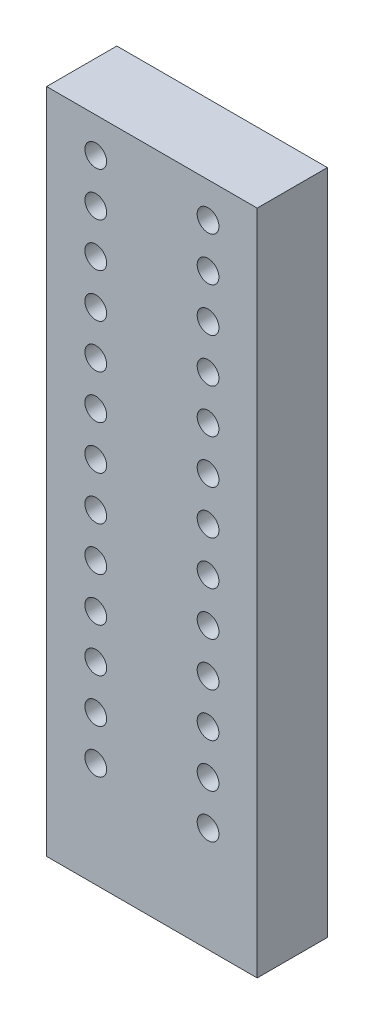
ISO-10303-21;
HEADER;
FILE_DESCRIPTION(('STEP AP214'),'2;1');
FILE_NAME('part.step','',(''),(''),'','','');
FILE_SCHEMA(('AUTOMOTIVE_DESIGN { 1 0 10303 214 1 1 1 1 }'));
ENDSEC;
DATA;
#1=APPLICATION_CONTEXT('core data for automotive mechanical design processes');
#2=APPLICATION_PROTOCOL_DEFINITION('international standard','automotive_design',2000,#1);
#3=PRODUCT_CONTEXT('',#1,'mechanical');
#4=PRODUCT('Part','Part','',(#3));
#5=PRODUCT_RELATED_PRODUCT_CATEGORY('part','',(#4));
#6=PRODUCT_DEFINITION_FORMATION('','',#4);
#7=PRODUCT_DEFINITION_CONTEXT('part definition',#1,'design');
#8=PRODUCT_DEFINITION('design','',#6,#7);
#9=PRODUCT_DEFINITION_SHAPE('','',#8);
#10=(LENGTH_UNIT() NAMED_UNIT(*) SI_UNIT(.MILLI.,.METRE.));
#11=(NAMED_UNIT(*) PLANE_ANGLE_UNIT() SI_UNIT($,.RADIAN.));
#12=(NAMED_UNIT(*) SI_UNIT($,.STERADIAN.) SOLID_ANGLE_UNIT());
#13=UNCERTAINTY_MEASURE_WITH_UNIT(LENGTH_MEASURE(1.E-05),#10,'distance_accuracy_value','');
#14=(GEOMETRIC_REPRESENTATION_CONTEXT(3) GLOBAL_UNCERTAINTY_ASSIGNED_CONTEXT((#13)) GLOBAL_UNIT_ASSIGNED_CONTEXT((#10,
#11,#12)) REPRESENTATION_CONTEXT('',''));
#15=CARTESIAN_POINT('',(0.,0.,0.));
#16=DIRECTION('',(0.,0.,1.));
#17=DIRECTION('',(1.,0.,0.));
#18=AXIS2_PLACEMENT_3D('',#15,#16,#17);
#19=CARTESIAN_POINT('',(16.,85.,20.));
#20=DIRECTION('',(0.,0.,1.));
#21=DIRECTION('',(1.,0.,0.));
#22=AXIS2_PLACEMENT_3D('',#19,#20,#21);
#23=CYLINDRICAL_SURFACE('',#22,3.09999999999999);
#24=CARTESIAN_POINT('',(16.,85.,0.));
#25=DIRECTION('',(0.,0.,1.));
#26=DIRECTION('',(1.,0.,0.));
#27=AXIS2_PLACEMENT_3D('',#24,#25,#26);
#28=CIRCLE('',#27,3.1);
#29=CARTESIAN_POINT('',(19.1,85.,0.));
#30=VERTEX_POINT('',#29);
#31=EDGE_CURVE('E43',#30,#30,#28,.T.);
#32=ORIENTED_EDGE('',*,*,#31,.F.);
#33=EDGE_LOOP('',(#32));
#34=FACE_BOUND('',#33,.T.);
#35=CARTESIAN_POINT('',(16.,85.,20.));
#36=DIRECTION('',(0.,0.,1.));
#37=DIRECTION('',(1.,0.,0.));
#38=AXIS2_PLACEMENT_3D('',#35,#36,#37);
#39=CIRCLE('',#38,3.09999999999999);
#40=CARTESIAN_POINT('',(19.1,85.,20.));
#41=VERTEX_POINT('',#40);
#42=EDGE_CURVE('E11',#41,#41,#39,.T.);
#43=ORIENTED_EDGE('',*,*,#42,.T.);
#44=EDGE_LOOP('',(#43));
#45=FACE_BOUND('',#44,.T.);
#46=ADVANCED_FACE('F35',(#34,#45),#23,.F.);
#47=CARTESIAN_POINT('',(16.,72.5,20.));
#48=DIRECTION('',(0.,0.,1.));
#49=DIRECTION('',(1.,0.,0.));
#50=AXIS2_PLACEMENT_3D('',#47,#48,#49);
#51=CYLINDRICAL_SURFACE('',#50,3.09999999999999);
#52=CARTESIAN_POINT('',(16.,72.5,0.));
#53=DIRECTION('',(0.,0.,1.));
#54=DIRECTION('',(1.,0.,0.));
#55=AXIS2_PLACEMENT_3D('',#52,#53,#54);
#56=CIRCLE('',#55,3.1);
#57=CARTESIAN_POINT('',(19.1,72.5,0.));
#58=VERTEX_POINT('',#57);
#59=EDGE_CURVE('E254',#58,#58,#56,.T.);
#60=ORIENTED_EDGE('',*,*,#59,.F.);
#61=EDGE_LOOP('',(#60));
#62=FACE_BOUND('',#61,.T.);
#63=CARTESIAN_POINT('',(16.,72.5,20.));
#64=DIRECTION('',(0.,0.,1.));
#65=DIRECTION('',(1.,0.,0.));
#66=AXIS2_PLACEMENT_3D('',#63,#64,#65);
#67=CIRCLE('',#66,3.09999999999999);
#68=CARTESIAN_POINT('',(19.1,72.5,20.));
#69=VERTEX_POINT('',#68);
#70=EDGE_CURVE('E257',#69,#69,#67,.T.);
#71=ORIENTED_EDGE('',*,*,#70,.T.);
#72=EDGE_LOOP('',(#71));
#73=FACE_BOUND('',#72,.T.);
#74=ADVANCED_FACE('F266',(#62,#73),#51,.F.);
#75=CARTESIAN_POINT('',(16.,60.,20.));
#76=DIRECTION('',(0.,0.,1.));
#77=DIRECTION('',(1.,0.,0.));
#78=AXIS2_PLACEMENT_3D('',#75,#76,#77);
#79=CYLINDRICAL_SURFACE('',#78,3.09999999999999);
#80=CARTESIAN_POINT('',(16.,60.,0.));
#81=DIRECTION('',(0.,0.,1.));
#82=DIRECTION('',(1.,0.,0.));
#83=AXIS2_PLACEMENT_3D('',#80,#81,#82);
#84=CIRCLE('',#83,3.1);
#85=CARTESIAN_POINT('',(19.1,60.,0.));
#86=VERTEX_POINT('',#85);
#87=EDGE_CURVE('E248',#86,#86,#84,.T.);
#88=ORIENTED_EDGE('',*,*,#87,.F.);
#89=EDGE_LOOP('',(#88));
#90=FACE_BOUND('',#89,.T.);
#91=CARTESIAN_POINT('',(16.,60.,20.));
#92=DIRECTION('',(0.,0.,1.));
#93=DIRECTION('',(1.,0.,0.));
#94=AXIS2_PLACEMENT_3D('',#91,#92,#93);
#95=CIRCLE('',#94,3.09999999999999);
#96=CARTESIAN_POINT('',(19.1,60.,20.));
#97=VERTEX_POINT('',#96);
#98=EDGE_CURVE('E251',#97,#97,#95,.T.);
#99=ORIENTED_EDGE('',*,*,#98,.T.);
#100=EDGE_LOOP('',(#99));
#101=FACE_BOUND('',#100,.T.);
#102=ADVANCED_FACE('F373',(#90,#101),#79,.F.);
#103=CARTESIAN_POINT('',(16.,47.5,20.));
#104=DIRECTION('',(0.,0.,1.));
#105=DIRECTION('',(1.,0.,0.));
#106=AXIS2_PLACEMENT_3D('',#103,#104,#105);
#107=CYLINDRICAL_SURFACE('',#106,3.09999999999999);
#108=CARTESIAN_POINT('',(16.,47.5,0.));
#109=DIRECTION('',(0.,0.,1.));
#110=DIRECTION('',(1.,0.,0.));
#111=AXIS2_PLACEMENT_3D('',#108,#109,#110);
#112=CIRCLE('',#111,3.1);
#113=CARTESIAN_POINT('',(19.1,47.5,0.));
#114=VERTEX_POINT('',#113);
#115=EDGE_CURVE('E242',#114,#114,#112,.T.);
#116=ORIENTED_EDGE('',*,*,#115,.F.);
#117=EDGE_LOOP('',(#116));
#118=FACE_BOUND('',#117,.T.);
#119=CARTESIAN_POINT('',(16.,47.5,20.));
#120=DIRECTION('',(0.,0.,1.));
#121=DIRECTION('',(1.,0.,0.));
#122=AXIS2_PLACEMENT_3D('',#119,#120,#121);
#123=CIRCLE('',#122,3.09999999999999);
#124=CARTESIAN_POINT('',(19.1,47.5,20.));
#125=VERTEX_POINT('',#124);
#126=EDGE_CURVE('E245',#125,#125,#123,.T.);
#127=ORIENTED_EDGE('',*,*,#126,.T.);
#128=EDGE_LOOP('',(#127));
#129=FACE_BOUND('',#128,.T.);
#130=ADVANCED_FACE('F369',(#118,#129),#107,.F.);
#131=CARTESIAN_POINT('',(16.,35.,20.));
#132=DIRECTION('',(0.,0.,1.));
#133=DIRECTION('',(1.,0.,0.));
#134=AXIS2_PLACEMENT_3D('',#131,#132,#133);
#135=CYLINDRICAL_SURFACE('',#134,3.09999999999999);
#136=CARTESIAN_POINT('',(16.,35.,0.));
#137=DIRECTION('',(0.,0.,1.));
#138=DIRECTION('',(1.,0.,0.));
#139=AXIS2_PLACEMENT_3D('',#136,#137,#138);
#140=CIRCLE('',#139,3.1);
#141=CARTESIAN_POINT('',(19.1,35.,0.));
#142=VERTEX_POINT('',#141);
#143=EDGE_CURVE('E236',#142,#142,#140,.T.);
#144=ORIENTED_EDGE('',*,*,#143,.F.);
#145=EDGE_LOOP('',(#144));
#146=FACE_BOUND('',#145,.T.);
#147=CARTESIAN_POINT('',(16.,35.,20.));
#148=DIRECTION('',(0.,0.,1.));
#149=DIRECTION('',(1.,0.,0.));
#150=AXIS2_PLACEMENT_3D('',#147,#148,#149);
#151=CIRCLE('',#150,3.09999999999999);
#152=CARTESIAN_POINT('',(19.1,35.,20.));
#153=VERTEX_POINT('',#152);
#154=EDGE_CURVE('E239',#153,#153,#151,.T.);
#155=ORIENTED_EDGE('',*,*,#154,.T.);
#156=EDGE_LOOP('',(#155));
#157=FACE_BOUND('',#156,.T.);
#158=ADVANCED_FACE('F365',(#146,#157),#135,.F.);
#159=CARTESIAN_POINT('',(16.,22.5,20.));
#160=DIRECTION('',(0.,0.,1.));
#161=DIRECTION('',(1.,0.,0.));
#162=AXIS2_PLACEMENT_3D('',#159,#160,#161);
#163=CYLINDRICAL_SURFACE('',#162,3.09999999999999);
#164=CARTESIAN_POINT('',(16.,22.5,0.));
#165=DIRECTION('',(0.,0.,1.));
#166=DIRECTION('',(1.,0.,0.));
#167=AXIS2_PLACEMENT_3D('',#164,#165,#166);
#168=CIRCLE('',#167,3.1);
#169=CARTESIAN_POINT('',(19.1,22.5,0.));
#170=VERTEX_POINT('',#169);
#171=EDGE_CURVE('E230',#170,#170,#168,.T.);
#172=ORIENTED_EDGE('',*,*,#171,.F.);
#173=EDGE_LOOP('',(#172));
#174=FACE_BOUND('',#173,.T.);
#175=CARTESIAN_POINT('',(16.,22.5,20.));
#176=DIRECTION('',(0.,0.,1.));
#177=DIRECTION('',(1.,0.,0.));
#178=AXIS2_PLACEMENT_3D('',#175,#176,#177);
#179=CIRCLE('',#178,3.09999999999999);
#180=CARTESIAN_POINT('',(19.1,22.5,20.));
#181=VERTEX_POINT('',#180);
#182=EDGE_CURVE('E233',#181,#181,#179,.T.);
#183=ORIENTED_EDGE('',*,*,#182,.T.);
#184=EDGE_LOOP('',(#183));
#185=FACE_BOUND('',#184,.T.);
#186=ADVANCED_FACE('F361',(#174,#185),#163,.F.);
#187=CARTESIAN_POINT('',(16.,10.,20.));
#188=DIRECTION('',(0.,0.,1.));
#189=DIRECTION('',(1.,0.,0.));
#190=AXIS2_PLACEMENT_3D('',#187,#188,#189);
#191=CYLINDRICAL_SURFACE('',#190,3.09999999999999);
#192=CARTESIAN_POINT('',(16.,10.,0.));
#193=DIRECTION('',(0.,0.,1.));
#194=DIRECTION('',(1.,0.,0.));
#195=AXIS2_PLACEMENT_3D('',#192,#193,#194);
#196=CIRCLE('',#195,3.1);
#197=CARTESIAN_POINT('',(19.1,10.,0.));
#198=VERTEX_POINT('',#197);
#199=EDGE_CURVE('E224',#198,#198,#196,.T.);
#200=ORIENTED_EDGE('',*,*,#199,.F.);
#201=EDGE_LOOP('',(#200));
#202=FACE_BOUND('',#201,.T.);
#203=CARTESIAN_POINT('',(16.,10.,20.));
#204=DIRECTION('',(0.,0.,1.));
#205=DIRECTION('',(1.,0.,0.));
#206=AXIS2_PLACEMENT_3D('',#203,#204,#205);
#207=CIRCLE('',#206,3.09999999999999);
#208=CARTESIAN_POINT('',(19.1,10.,20.));
#209=VERTEX_POINT('',#208);
#210=EDGE_CURVE('E227',#209,#209,#207,.T.);
#211=ORIENTED_EDGE('',*,*,#210,.T.);
#212=EDGE_LOOP('',(#211));
#213=FACE_BOUND('',#212,.T.);
#214=ADVANCED_FACE('F357',(#202,#213),#191,.F.);
#215=CARTESIAN_POINT('',(16.,-2.5,20.));
#216=DIRECTION('',(0.,0.,1.));
#217=DIRECTION('',(1.,0.,0.));
#218=AXIS2_PLACEMENT_3D('',#215,#216,#217);
#219=CYLINDRICAL_SURFACE('',#218,3.09999999999999);
#220=CARTESIAN_POINT('',(16.,-2.5,0.));
#221=DIRECTION('',(0.,0.,1.));
#222=DIRECTION('',(1.,0.,0.));
#223=AXIS2_PLACEMENT_3D('',#220,#221,#222);
#224=CIRCLE('',#223,3.1);
#225=CARTESIAN_POINT('',(19.1,-2.5,0.));
#226=VERTEX_POINT('',#225);
#227=EDGE_CURVE('E218',#226,#226,#224,.T.);
#228=ORIENTED_EDGE('',*,*,#227,.F.);
#229=EDGE_LOOP('',(#228));
#230=FACE_BOUND('',#229,.T.);
#231=CARTESIAN_POINT('',(16.,-2.5,20.));
#232=DIRECTION('',(0.,0.,1.));
#233=DIRECTION('',(1.,0.,0.));
#234=AXIS2_PLACEMENT_3D('',#231,#232,#233);
#235=CIRCLE('',#234,3.09999999999999);
#236=CARTESIAN_POINT('',(19.1,-2.5,20.));
#237=VERTEX_POINT('',#236);
#238=EDGE_CURVE('E221',#237,#237,#235,.T.);
#239=ORIENTED_EDGE('',*,*,#238,.T.);
#240=EDGE_LOOP('',(#239));
#241=FACE_BOUND('',#240,.T.);
#242=ADVANCED_FACE('F353',(#230,#241),#219,.F.);
#243=CARTESIAN_POINT('',(16.,-15.,20.));
#244=DIRECTION('',(0.,0.,1.));
#245=DIRECTION('',(1.,0.,0.));
#246=AXIS2_PLACEMENT_3D('',#243,#244,#245);
#247=CYLINDRICAL_SURFACE('',#246,3.09999999999999);
#248=CARTESIAN_POINT('',(16.,-15.,0.));
#249=DIRECTION('',(0.,0.,1.));
#250=DIRECTION('',(1.,0.,0.));
#251=AXIS2_PLACEMENT_3D('',#248,#249,#250);
#252=CIRCLE('',#251,3.1);
#253=CARTESIAN_POINT('',(19.1,-15.,0.));
#254=VERTEX_POINT('',#253);
#255=EDGE_CURVE('E212',#254,#254,#252,.T.);
#256=ORIENTED_EDGE('',*,*,#255,.F.);
#257=EDGE_LOOP('',(#256));
#258=FACE_BOUND('',#257,.T.);
#259=CARTESIAN_POINT('',(16.,-15.,20.));
#260=DIRECTION('',(0.,0.,1.));
#261=DIRECTION('',(1.,0.,0.));
#262=AXIS2_PLACEMENT_3D('',#259,#260,#261);
#263=CIRCLE('',#262,3.09999999999999);
#264=CARTESIAN_POINT('',(19.1,-15.,20.));
#265=VERTEX_POINT('',#264);
#266=EDGE_CURVE('E215',#265,#265,#263,.T.);
#267=ORIENTED_EDGE('',*,*,#266,.T.);
#268=EDGE_LOOP('',(#267));
#269=FACE_BOUND('',#268,.T.);
#270=ADVANCED_FACE('F349',(#258,#269),#247,.F.);
#271=CARTESIAN_POINT('',(16.,-27.5,20.));
#272=DIRECTION('',(0.,0.,1.));
#273=DIRECTION('',(1.,0.,0.));
#274=AXIS2_PLACEMENT_3D('',#271,#272,#273);
#275=CYLINDRICAL_SURFACE('',#274,3.09999999999999);
#276=CARTESIAN_POINT('',(16.,-27.5,0.));
#277=DIRECTION('',(0.,0.,1.));
#278=DIRECTION('',(1.,0.,0.));
#279=AXIS2_PLACEMENT_3D('',#276,#277,#278);
#280=CIRCLE('',#279,3.1);
#281=CARTESIAN_POINT('',(19.1,-27.5,0.));
#282=VERTEX_POINT('',#281);
#283=EDGE_CURVE('E206',#282,#282,#280,.T.);
#284=ORIENTED_EDGE('',*,*,#283,.F.);
#285=EDGE_LOOP('',(#284));
#286=FACE_BOUND('',#285,.T.);
#287=CARTESIAN_POINT('',(16.,-27.5,20.));
#288=DIRECTION('',(0.,0.,1.));
#289=DIRECTION('',(1.,0.,0.));
#290=AXIS2_PLACEMENT_3D('',#287,#288,#289);
#291=CIRCLE('',#290,3.09999999999999);
#292=CARTESIAN_POINT('',(19.1,-27.5,20.));
#293=VERTEX_POINT('',#292);
#294=EDGE_CURVE('E209',#293,#293,#291,.T.);
#295=ORIENTED_EDGE('',*,*,#294,.T.);
#296=EDGE_LOOP('',(#295));
#297=FACE_BOUND('',#296,.T.);
#298=ADVANCED_FACE('F345',(#286,#297),#275,.F.);
#299=CARTESIAN_POINT('',(16.,-40.,20.));
#300=DIRECTION('',(0.,0.,1.));
#301=DIRECTION('',(1.,0.,0.));
#302=AXIS2_PLACEMENT_3D('',#299,#300,#301);
#303=CYLINDRICAL_SURFACE('',#302,3.09999999999999);
#304=CARTESIAN_POINT('',(16.,-40.,0.));
#305=DIRECTION('',(0.,0.,1.));
#306=DIRECTION('',(1.,0.,0.));
#307=AXIS2_PLACEMENT_3D('',#304,#305,#306);
#308=CIRCLE('',#307,3.1);
#309=CARTESIAN_POINT('',(19.1,-40.,0.));
#310=VERTEX_POINT('',#309);
#311=EDGE_CURVE('E200',#310,#310,#308,.T.);
#312=ORIENTED_EDGE('',*,*,#311,.F.);
#313=EDGE_LOOP('',(#312));
#314=FACE_BOUND('',#313,.T.);
#315=CARTESIAN_POINT('',(16.,-40.,20.));
#316=DIRECTION('',(0.,0.,1.));
#317=DIRECTION('',(1.,0.,0.));
#318=AXIS2_PLACEMENT_3D('',#315,#316,#317);
#319=CIRCLE('',#318,3.09999999999999);
#320=CARTESIAN_POINT('',(19.1,-40.,20.));
#321=VERTEX_POINT('',#320);
#322=EDGE_CURVE('E203',#321,#321,#319,.T.);
#323=ORIENTED_EDGE('',*,*,#322,.T.);
#324=EDGE_LOOP('',(#323));
#325=FACE_BOUND('',#324,.T.);
#326=ADVANCED_FACE('F341',(#314,#325),#303,.F.);
#327=CARTESIAN_POINT('',(-16.,85.,20.));
#328=DIRECTION('',(0.,0.,1.));
#329=DIRECTION('',(1.,0.,0.));
#330=AXIS2_PLACEMENT_3D('',#327,#328,#329);
#331=CYLINDRICAL_SURFACE('',#330,3.09999999999999);
#332=CARTESIAN_POINT('',(-16.,85.,0.));
#333=DIRECTION('',(0.,0.,1.));
#334=DIRECTION('',(1.,0.,0.));
#335=AXIS2_PLACEMENT_3D('',#332,#333,#334);
#336=CIRCLE('',#335,3.1);
#337=CARTESIAN_POINT('',(-12.9,85.,0.));
#338=VERTEX_POINT('',#337);
#339=EDGE_CURVE('E194',#338,#338,#336,.T.);
#340=ORIENTED_EDGE('',*,*,#339,.F.);
#341=EDGE_LOOP('',(#340));
#342=FACE_BOUND('',#341,.T.);
#343=CARTESIAN_POINT('',(-16.,85.,20.));
#344=DIRECTION('',(0.,0.,1.));
#345=DIRECTION('',(1.,0.,0.));
#346=AXIS2_PLACEMENT_3D('',#343,#344,#345);
#347=CIRCLE('',#346,3.09999999999999);
#348=CARTESIAN_POINT('',(-12.9,85.,20.));
#349=VERTEX_POINT('',#348);
#350=EDGE_CURVE('E197',#349,#349,#347,.T.);
#351=ORIENTED_EDGE('',*,*,#350,.T.);
#352=EDGE_LOOP('',(#351));
#353=FACE_BOUND('',#352,.T.);
#354=ADVANCED_FACE('F337',(#342,#353),#331,.F.);
#355=CARTESIAN_POINT('',(-16.,72.5,20.));
#356=DIRECTION('',(0.,0.,1.));
#357=DIRECTION('',(1.,0.,0.));
#358=AXIS2_PLACEMENT_3D('',#355,#356,#357);
#359=CYLINDRICAL_SURFACE('',#358,3.09999999999999);
#360=CARTESIAN_POINT('',(-16.,72.5,0.));
#361=DIRECTION('',(0.,0.,1.));
#362=DIRECTION('',(1.,0.,0.));
#363=AXIS2_PLACEMENT_3D('',#360,#361,#362);
#364=CIRCLE('',#363,3.1);
#365=CARTESIAN_POINT('',(-12.9,72.5,0.));
#366=VERTEX_POINT('',#365);
#367=EDGE_CURVE('E188',#366,#366,#364,.T.);
#368=ORIENTED_EDGE('',*,*,#367,.F.);
#369=EDGE_LOOP('',(#368));
#370=FACE_BOUND('',#369,.T.);
#371=CARTESIAN_POINT('',(-16.,72.5,20.));
#372=DIRECTION('',(0.,0.,1.));
#373=DIRECTION('',(1.,0.,0.));
#374=AXIS2_PLACEMENT_3D('',#371,#372,#373);
#375=CIRCLE('',#374,3.09999999999999);
#376=CARTESIAN_POINT('',(-12.9,72.5,20.));
#377=VERTEX_POINT('',#376);
#378=EDGE_CURVE('E191',#377,#377,#375,.T.);
#379=ORIENTED_EDGE('',*,*,#378,.T.);
#380=EDGE_LOOP('',(#379));
#381=FACE_BOUND('',#380,.T.);
#382=ADVANCED_FACE('F333',(#370,#381),#359,.F.);
#383=CARTESIAN_POINT('',(-16.,60.,20.));
#384=DIRECTION('',(0.,0.,1.));
#385=DIRECTION('',(1.,0.,0.));
#386=AXIS2_PLACEMENT_3D('',#383,#384,#385);
#387=CYLINDRICAL_SURFACE('',#386,3.09999999999999);
#388=CARTESIAN_POINT('',(-16.,60.,0.));
#389=DIRECTION('',(0.,0.,1.));
#390=DIRECTION('',(1.,0.,0.));
#391=AXIS2_PLACEMENT_3D('',#388,#389,#390);
#392=CIRCLE('',#391,3.1);
#393=CARTESIAN_POINT('',(-12.9,60.,0.));
#394=VERTEX_POINT('',#393);
#395=EDGE_CURVE('E182',#394,#394,#392,.T.);
#396=ORIENTED_EDGE('',*,*,#395,.F.);
#397=EDGE_LOOP('',(#396));
#398=FACE_BOUND('',#397,.T.);
#399=CARTESIAN_POINT('',(-16.,60.,20.));
#400=DIRECTION('',(0.,0.,1.));
#401=DIRECTION('',(1.,0.,0.));
#402=AXIS2_PLACEMENT_3D('',#399,#400,#401);
#403=CIRCLE('',#402,3.09999999999999);
#404=CARTESIAN_POINT('',(-12.9,60.,20.));
#405=VERTEX_POINT('',#404);
#406=EDGE_CURVE('E185',#405,#405,#403,.T.);
#407=ORIENTED_EDGE('',*,*,#406,.T.);
#408=EDGE_LOOP('',(#407));
#409=FACE_BOUND('',#408,.T.);
#410=ADVANCED_FACE('F329',(#398,#409),#387,.F.);
#411=CARTESIAN_POINT('',(-16.,47.5,20.));
#412=DIRECTION('',(0.,0.,1.));
#413=DIRECTION('',(1.,0.,0.));
#414=AXIS2_PLACEMENT_3D('',#411,#412,#413);
#415=CYLINDRICAL_SURFACE('',#414,3.09999999999999);
#416=CARTESIAN_POINT('',(-16.,47.5,0.));
#417=DIRECTION('',(0.,0.,1.));
#418=DIRECTION('',(1.,0.,0.));
#419=AXIS2_PLACEMENT_3D('',#416,#417,#418);
#420=CIRCLE('',#419,3.1);
#421=CARTESIAN_POINT('',(-12.9,47.5,0.));
#422=VERTEX_POINT('',#421);
#423=EDGE_CURVE('E176',#422,#422,#420,.T.);
#424=ORIENTED_EDGE('',*,*,#423,.F.);
#425=EDGE_LOOP('',(#424));
#426=FACE_BOUND('',#425,.T.);
#427=CARTESIAN_POINT('',(-16.,47.5,20.));
#428=DIRECTION('',(0.,0.,1.));
#429=DIRECTION('',(1.,0.,0.));
#430=AXIS2_PLACEMENT_3D('',#427,#428,#429);
#431=CIRCLE('',#430,3.09999999999999);
#432=CARTESIAN_POINT('',(-12.9,47.5,20.));
#433=VERTEX_POINT('',#432);
#434=EDGE_CURVE('E179',#433,#433,#431,.T.);
#435=ORIENTED_EDGE('',*,*,#434,.T.);
#436=EDGE_LOOP('',(#435));
#437=FACE_BOUND('',#436,.T.);
#438=ADVANCED_FACE('F325',(#426,#437),#415,.F.);
#439=CARTESIAN_POINT('',(-16.,35.,20.));
#440=DIRECTION('',(0.,0.,1.));
#441=DIRECTION('',(1.,0.,0.));
#442=AXIS2_PLACEMENT_3D('',#439,#440,#441);
#443=CYLINDRICAL_SURFACE('',#442,3.09999999999999);
#444=CARTESIAN_POINT('',(-16.,35.,0.));
#445=DIRECTION('',(0.,0.,1.));
#446=DIRECTION('',(1.,0.,0.));
#447=AXIS2_PLACEMENT_3D('',#444,#445,#446);
#448=CIRCLE('',#447,3.1);
#449=CARTESIAN_POINT('',(-12.9,35.,0.));
#450=VERTEX_POINT('',#449);
#451=EDGE_CURVE('E170',#450,#450,#448,.T.);
#452=ORIENTED_EDGE('',*,*,#451,.F.);
#453=EDGE_LOOP('',(#452));
#454=FACE_BOUND('',#453,.T.);
#455=CARTESIAN_POINT('',(-16.,35.,20.));
#456=DIRECTION('',(0.,0.,1.));
#457=DIRECTION('',(1.,0.,0.));
#458=AXIS2_PLACEMENT_3D('',#455,#456,#457);
#459=CIRCLE('',#458,3.09999999999999);
#460=CARTESIAN_POINT('',(-12.9,35.,20.));
#461=VERTEX_POINT('',#460);
#462=EDGE_CURVE('E173',#461,#461,#459,.T.);
#463=ORIENTED_EDGE('',*,*,#462,.T.);
#464=EDGE_LOOP('',(#463));
#465=FACE_BOUND('',#464,.T.);
#466=ADVANCED_FACE('F321',(#454,#465),#443,.F.);
#467=CARTESIAN_POINT('',(-16.,22.5,20.));
#468=DIRECTION('',(0.,0.,1.));
#469=DIRECTION('',(1.,0.,0.));
#470=AXIS2_PLACEMENT_3D('',#467,#468,#469);
#471=CYLINDRICAL_SURFACE('',#470,3.09999999999999);
#472=CARTESIAN_POINT('',(-16.,22.5,0.));
#473=DIRECTION('',(0.,0.,1.));
#474=DIRECTION('',(1.,0.,0.));
#475=AXIS2_PLACEMENT_3D('',#472,#473,#474);
#476=CIRCLE('',#475,3.1);
#477=CARTESIAN_POINT('',(-12.9,22.5,0.));
#478=VERTEX_POINT('',#477);
#479=EDGE_CURVE('E164',#478,#478,#476,.T.);
#480=ORIENTED_EDGE('',*,*,#479,.F.);
#481=EDGE_LOOP('',(#480));
#482=FACE_BOUND('',#481,.T.);
#483=CARTESIAN_POINT('',(-16.,22.5,20.));
#484=DIRECTION('',(0.,0.,1.));
#485=DIRECTION('',(1.,0.,0.));
#486=AXIS2_PLACEMENT_3D('',#483,#484,#485);
#487=CIRCLE('',#486,3.09999999999999);
#488=CARTESIAN_POINT('',(-12.9,22.5,20.));
#489=VERTEX_POINT('',#488);
#490=EDGE_CURVE('E167',#489,#489,#487,.T.);
#491=ORIENTED_EDGE('',*,*,#490,.T.);
#492=EDGE_LOOP('',(#491));
#493=FACE_BOUND('',#492,.T.);
#494=ADVANCED_FACE('F317',(#482,#493),#471,.F.);
#495=CARTESIAN_POINT('',(-16.,10.,20.));
#496=DIRECTION('',(0.,0.,1.));
#497=DIRECTION('',(1.,0.,0.));
#498=AXIS2_PLACEMENT_3D('',#495,#496,#497);
#499=CYLINDRICAL_SURFACE('',#498,3.09999999999999);
#500=CARTESIAN_POINT('',(-16.,10.,0.));
#501=DIRECTION('',(0.,0.,1.));
#502=DIRECTION('',(1.,0.,0.));
#503=AXIS2_PLACEMENT_3D('',#500,#501,#502);
#504=CIRCLE('',#503,3.1);
#505=CARTESIAN_POINT('',(-12.9,10.,0.));
#506=VERTEX_POINT('',#505);
#507=EDGE_CURVE('E158',#506,#506,#504,.T.);
#508=ORIENTED_EDGE('',*,*,#507,.F.);
#509=EDGE_LOOP('',(#508));
#510=FACE_BOUND('',#509,.T.);
#511=CARTESIAN_POINT('',(-16.,10.,20.));
#512=DIRECTION('',(0.,0.,1.));
#513=DIRECTION('',(1.,0.,0.));
#514=AXIS2_PLACEMENT_3D('',#511,#512,#513);
#515=CIRCLE('',#514,3.09999999999999);
#516=CARTESIAN_POINT('',(-12.9,10.,20.));
#517=VERTEX_POINT('',#516);
#518=EDGE_CURVE('E161',#517,#517,#515,.T.);
#519=ORIENTED_EDGE('',*,*,#518,.T.);
#520=EDGE_LOOP('',(#519));
#521=FACE_BOUND('',#520,.T.);
#522=ADVANCED_FACE('F313',(#510,#521),#499,.F.);
#523=CARTESIAN_POINT('',(-16.,-2.5,20.));
#524=DIRECTION('',(0.,0.,1.));
#525=DIRECTION('',(1.,0.,0.));
#526=AXIS2_PLACEMENT_3D('',#523,#524,#525);
#527=CYLINDRICAL_SURFACE('',#526,3.09999999999999);
#528=CARTESIAN_POINT('',(-16.,-2.5,0.));
#529=DIRECTION('',(0.,0.,1.));
#530=DIRECTION('',(1.,0.,0.));
#531=AXIS2_PLACEMENT_3D('',#528,#529,#530);
#532=CIRCLE('',#531,3.1);
#533=CARTESIAN_POINT('',(-12.9,-2.5,0.));
#534=VERTEX_POINT('',#533);
#535=EDGE_CURVE('E152',#534,#534,#532,.T.);
#536=ORIENTED_EDGE('',*,*,#535,.F.);
#537=EDGE_LOOP('',(#536));
#538=FACE_BOUND('',#537,.T.);
#539=CARTESIAN_POINT('',(-16.,-2.5,20.));
#540=DIRECTION('',(0.,0.,1.));
#541=DIRECTION('',(1.,0.,0.));
#542=AXIS2_PLACEMENT_3D('',#539,#540,#541);
#543=CIRCLE('',#542,3.09999999999999);
#544=CARTESIAN_POINT('',(-12.9,-2.5,20.));
#545=VERTEX_POINT('',#544);
#546=EDGE_CURVE('E155',#545,#545,#543,.T.);
#547=ORIENTED_EDGE('',*,*,#546,.T.);
#548=EDGE_LOOP('',(#547));
#549=FACE_BOUND('',#548,.T.);
#550=ADVANCED_FACE('F309',(#538,#549),#527,.F.);
#551=CARTESIAN_POINT('',(-16.,-15.,20.));
#552=DIRECTION('',(0.,0.,1.));
#553=DIRECTION('',(1.,0.,0.));
#554=AXIS2_PLACEMENT_3D('',#551,#552,#553);
#555=CYLINDRICAL_SURFACE('',#554,3.09999999999999);
#556=CARTESIAN_POINT('',(-16.,-15.,0.));
#557=DIRECTION('',(0.,0.,1.));
#558=DIRECTION('',(1.,0.,0.));
#559=AXIS2_PLACEMENT_3D('',#556,#557,#558);
#560=CIRCLE('',#559,3.1);
#561=CARTESIAN_POINT('',(-12.9,-15.,0.));
#562=VERTEX_POINT('',#561);
#563=EDGE_CURVE('E146',#562,#562,#560,.T.);
#564=ORIENTED_EDGE('',*,*,#563,.F.);
#565=EDGE_LOOP('',(#564));
#566=FACE_BOUND('',#565,.T.);
#567=CARTESIAN_POINT('',(-16.,-15.,20.));
#568=DIRECTION('',(0.,0.,1.));
#569=DIRECTION('',(1.,0.,0.));
#570=AXIS2_PLACEMENT_3D('',#567,#568,#569);
#571=CIRCLE('',#570,3.09999999999999);
#572=CARTESIAN_POINT('',(-12.9,-15.,20.));
#573=VERTEX_POINT('',#572);
#574=EDGE_CURVE('E149',#573,#573,#571,.T.);
#575=ORIENTED_EDGE('',*,*,#574,.T.);
#576=EDGE_LOOP('',(#575));
#577=FACE_BOUND('',#576,.T.);
#578=ADVANCED_FACE('F305',(#566,#577),#555,.F.);
#579=CARTESIAN_POINT('',(-16.,-27.5,20.));
#580=DIRECTION('',(0.,0.,1.));
#581=DIRECTION('',(1.,0.,0.));
#582=AXIS2_PLACEMENT_3D('',#579,#580,#581);
#583=CYLINDRICAL_SURFACE('',#582,3.09999999999999);
#584=CARTESIAN_POINT('',(-16.,-27.5,0.));
#585=DIRECTION('',(0.,0.,1.));
#586=DIRECTION('',(1.,0.,0.));
#587=AXIS2_PLACEMENT_3D('',#584,#585,#586);
#588=CIRCLE('',#587,3.1);
#589=CARTESIAN_POINT('',(-12.9,-27.5,0.));
#590=VERTEX_POINT('',#589);
#591=EDGE_CURVE('E140',#590,#590,#588,.T.);
#592=ORIENTED_EDGE('',*,*,#591,.F.);
#593=EDGE_LOOP('',(#592));
#594=FACE_BOUND('',#593,.T.);
#595=CARTESIAN_POINT('',(-16.,-27.5,20.));
#596=DIRECTION('',(0.,0.,1.));
#597=DIRECTION('',(1.,0.,0.));
#598=AXIS2_PLACEMENT_3D('',#595,#596,#597);
#599=CIRCLE('',#598,3.09999999999999);
#600=CARTESIAN_POINT('',(-12.9,-27.5,20.));
#601=VERTEX_POINT('',#600);
#602=EDGE_CURVE('E143',#601,#601,#599,.T.);
#603=ORIENTED_EDGE('',*,*,#602,.T.);
#604=EDGE_LOOP('',(#603));
#605=FACE_BOUND('',#604,.T.);
#606=ADVANCED_FACE('F281',(#594,#605),#583,.F.);
#607=CARTESIAN_POINT('',(-16.,-40.,20.));
#608=DIRECTION('',(0.,0.,1.));
#609=DIRECTION('',(1.,0.,0.));
#610=AXIS2_PLACEMENT_3D('',#607,#608,#609);
#611=CYLINDRICAL_SURFACE('',#610,3.09999999999999);
#612=CARTESIAN_POINT('',(-16.,-40.,0.));
#613=DIRECTION('',(0.,0.,1.));
#614=DIRECTION('',(1.,0.,0.));
#615=AXIS2_PLACEMENT_3D('',#612,#613,#614);
#616=CIRCLE('',#615,3.1);
#617=CARTESIAN_POINT('',(-12.9,-40.,0.));
#618=VERTEX_POINT('',#617);
#619=EDGE_CURVE('E134',#618,#618,#616,.T.);
#620=ORIENTED_EDGE('',*,*,#619,.F.);
#621=EDGE_LOOP('',(#620));
#622=FACE_BOUND('',#621,.T.);
#623=CARTESIAN_POINT('',(-16.,-40.,20.));
#624=DIRECTION('',(0.,0.,1.));
#625=DIRECTION('',(1.,0.,0.));
#626=AXIS2_PLACEMENT_3D('',#623,#624,#625);
#627=CIRCLE('',#626,3.09999999999999);
#628=CARTESIAN_POINT('',(-12.9,-40.,20.));
#629=VERTEX_POINT('',#628);
#630=EDGE_CURVE('E137',#629,#629,#627,.T.);
#631=ORIENTED_EDGE('',*,*,#630,.T.);
#632=EDGE_LOOP('',(#631));
#633=FACE_BOUND('',#632,.T.);
#634=ADVANCED_FACE('F271',(#622,#633),#611,.F.);
#635=CARTESIAN_POINT('',(0.,0.,20.));
#636=DIRECTION('',(0.,0.,-1.));
#637=DIRECTION('',(-1.,0.,0.));
#638=AXIS2_PLACEMENT_3D('',#635,#636,#637);
#639=PLANE('',#638);
#640=CARTESIAN_POINT('',(16.,-52.5,20.));
#641=DIRECTION('',(0.,0.,1.));
#642=DIRECTION('',(1.,0.,0.));
#643=AXIS2_PLACEMENT_3D('',#640,#641,#642);
#644=CIRCLE('',#643,3.09999999999999);
#645=CARTESIAN_POINT('',(19.1,-52.5,20.));
#646=VERTEX_POINT('',#645);
#647=EDGE_CURVE('E650',#646,#646,#644,.T.);
#648=ORIENTED_EDGE('',*,*,#647,.F.);
#649=EDGE_LOOP('',(#648));
#650=FACE_BOUND('',#649,.T.);
#651=CARTESIAN_POINT('',(-16.,-52.5,20.));
#652=DIRECTION('',(0.,0.,1.));
#653=DIRECTION('',(1.,0.,0.));
#654=AXIS2_PLACEMENT_3D('',#651,#652,#653);
#655=CIRCLE('',#654,3.09999999999999);
#656=CARTESIAN_POINT('',(-12.9,-52.5,20.));
#657=VERTEX_POINT('',#656);
#658=EDGE_CURVE('E644',#657,#657,#655,.T.);
#659=ORIENTED_EDGE('',*,*,#658,.F.);
#660=EDGE_LOOP('',(#659));
#661=FACE_BOUND('',#660,.T.);
#662=CARTESIAN_POINT('',(16.,-65.,20.));
#663=DIRECTION('',(0.,0.,1.));
#664=DIRECTION('',(1.,0.,0.));
#665=AXIS2_PLACEMENT_3D('',#662,#663,#664);
#666=CIRCLE('',#665,3.09999999999999);
#667=CARTESIAN_POINT('',(19.1,-65.,20.));
#668=VERTEX_POINT('',#667);
#669=EDGE_CURVE('E634',#668,#668,#666,.T.);
#670=ORIENTED_EDGE('',*,*,#669,.F.);
#671=EDGE_LOOP('',(#670));
#672=FACE_BOUND('',#671,.T.);
#673=DIRECTION('',(0.,1.,0.));
#674=VECTOR('',#673,1.);
#675=CARTESIAN_POINT('',(30.,-95.,20.));
#676=LINE('',#675,#674);
#677=CARTESIAN_POINT('',(30.,-95.,20.));
#678=VERTEX_POINT('',#677);
#679=CARTESIAN_POINT('',(30.,95.,20.));
#680=VERTEX_POINT('',#679);
#681=EDGE_CURVE('E114',#678,#680,#676,.T.);
#682=ORIENTED_EDGE('',*,*,#681,.T.);
#683=DIRECTION('',(-1.,0.,0.));
#684=VECTOR('',#683,1.);
#685=CARTESIAN_POINT('',(-30.,95.,20.));
#686=LINE('',#685,#684);
#687=CARTESIAN_POINT('',(-30.,95.,20.));
#688=VERTEX_POINT('',#687);
#689=EDGE_CURVE('E83',#680,#688,#686,.T.);
#690=ORIENTED_EDGE('',*,*,#689,.T.);
#691=DIRECTION('',(0.,-1.,0.));
#692=VECTOR('',#691,1.);
#693=CARTESIAN_POINT('',(-30.,-95.,20.));
#694=LINE('',#693,#692);
#695=CARTESIAN_POINT('',(-30.,-95.,20.));
#696=VERTEX_POINT('',#695);
#697=EDGE_CURVE('E117',#688,#696,#694,.T.);
#698=ORIENTED_EDGE('',*,*,#697,.T.);
#699=DIRECTION('',(1.,0.,0.));
#700=VECTOR('',#699,1.);
#701=CARTESIAN_POINT('',(-30.,-95.,20.));
#702=LINE('',#701,#700);
#703=EDGE_CURVE('E51',#696,#678,#702,.T.);
#704=ORIENTED_EDGE('',*,*,#703,.T.);
#705=EDGE_LOOP('',(#682,#690,#698,#704));
#706=FACE_BOUND('',#705,.T.);
#707=CARTESIAN_POINT('',(-16.,-65.,20.));
#708=DIRECTION('',(0.,0.,1.));
#709=DIRECTION('',(1.,0.,0.));
#710=AXIS2_PLACEMENT_3D('',#707,#708,#709);
#711=CIRCLE('',#710,3.09999999999999);
#712=CARTESIAN_POINT('',(-12.9,-65.,20.));
#713=VERTEX_POINT('',#712);
#714=EDGE_CURVE('E639',#713,#713,#711,.T.);
#715=ORIENTED_EDGE('',*,*,#714,.F.);
#716=EDGE_LOOP('',(#715));
#717=FACE_BOUND('',#716,.T.);
#718=ORIENTED_EDGE('',*,*,#630,.F.);
#719=EDGE_LOOP('',(#718));
#720=FACE_BOUND('',#719,.T.);
#721=ORIENTED_EDGE('',*,*,#602,.F.);
#722=EDGE_LOOP('',(#721));
#723=FACE_BOUND('',#722,.T.);
#724=ORIENTED_EDGE('',*,*,#574,.F.);
#725=EDGE_LOOP('',(#724));
#726=FACE_BOUND('',#725,.T.);
#727=ORIENTED_EDGE('',*,*,#546,.F.);
#728=EDGE_LOOP('',(#727));
#729=FACE_BOUND('',#728,.T.);
#730=ORIENTED_EDGE('',*,*,#518,.F.);
#731=EDGE_LOOP('',(#730));
#732=FACE_BOUND('',#731,.T.);
#733=ORIENTED_EDGE('',*,*,#490,.F.);
#734=EDGE_LOOP('',(#733));
#735=FACE_BOUND('',#734,.T.);
#736=ORIENTED_EDGE('',*,*,#462,.F.);
#737=EDGE_LOOP('',(#736));
#738=FACE_BOUND('',#737,.T.);
#739=ORIENTED_EDGE('',*,*,#434,.F.);
#740=EDGE_LOOP('',(#739));
#741=FACE_BOUND('',#740,.T.);
#742=ORIENTED_EDGE('',*,*,#406,.F.);
#743=EDGE_LOOP('',(#742));
#744=FACE_BOUND('',#743,.T.);
#745=ORIENTED_EDGE('',*,*,#378,.F.);
#746=EDGE_LOOP('',(#745));
#747=FACE_BOUND('',#746,.T.);
#748=ORIENTED_EDGE('',*,*,#350,.F.);
#749=EDGE_LOOP('',(#748));
#750=FACE_BOUND('',#749,.T.);
#751=ORIENTED_EDGE('',*,*,#322,.F.);
#752=EDGE_LOOP('',(#751));
#753=FACE_BOUND('',#752,.T.);
#754=ORIENTED_EDGE('',*,*,#294,.F.);
#755=EDGE_LOOP('',(#754));
#756=FACE_BOUND('',#755,.T.);
#757=ORIENTED_EDGE('',*,*,#266,.F.);
#758=EDGE_LOOP('',(#757));
#759=FACE_BOUND('',#758,.T.);
#760=ORIENTED_EDGE('',*,*,#238,.F.);
#761=EDGE_LOOP('',(#760));
#762=FACE_BOUND('',#761,.T.);
#763=ORIENTED_EDGE('',*,*,#210,.F.);
#764=EDGE_LOOP('',(#763));
#765=FACE_BOUND('',#764,.T.);
#766=ORIENTED_EDGE('',*,*,#182,.F.);
#767=EDGE_LOOP('',(#766));
#768=FACE_BOUND('',#767,.T.);
#769=ORIENTED_EDGE('',*,*,#154,.F.);
#770=EDGE_LOOP('',(#769));
#771=FACE_BOUND('',#770,.T.);
#772=ORIENTED_EDGE('',*,*,#126,.F.);
#773=EDGE_LOOP('',(#772));
#774=FACE_BOUND('',#773,.T.);
#775=ORIENTED_EDGE('',*,*,#98,.F.);
#776=EDGE_LOOP('',(#775));
#777=FACE_BOUND('',#776,.T.);
#778=ORIENTED_EDGE('',*,*,#70,.F.);
#779=EDGE_LOOP('',(#778));
#780=FACE_BOUND('',#779,.T.);
#781=ORIENTED_EDGE('',*,*,#42,.F.);
#782=EDGE_LOOP('',(#781));
#783=FACE_BOUND('',#782,.T.);
#784=ADVANCED_FACE('F269',(#650,#661,#672,#706,#717,#720,#723,#726,#729,#732,#735,#738,#741,
#744,#747,#750,#753,#756,#759,#762,#765,#768,#771,#774,#777,#780,#783),#639,.F.);
#785=CARTESIAN_POINT('',(0.,0.,0.));
#786=DIRECTION('',(0.,0.,-1.));
#787=DIRECTION('',(-1.,0.,0.));
#788=AXIS2_PLACEMENT_3D('',#785,#786,#787);
#789=PLANE('',#788);
#790=CARTESIAN_POINT('',(16.,-52.5,0.));
#791=DIRECTION('',(0.,0.,1.));
#792=DIRECTION('',(1.,0.,0.));
#793=AXIS2_PLACEMENT_3D('',#790,#791,#792);
#794=CIRCLE('',#793,3.1);
#795=CARTESIAN_POINT('',(19.1,-52.5,0.));
#796=VERTEX_POINT('',#795);
#797=EDGE_CURVE('E653',#796,#796,#794,.T.);
#798=ORIENTED_EDGE('',*,*,#797,.T.);
#799=EDGE_LOOP('',(#798));
#800=FACE_BOUND('',#799,.T.);
#801=CARTESIAN_POINT('',(-16.,-52.5,0.));
#802=DIRECTION('',(0.,0.,1.));
#803=DIRECTION('',(1.,0.,0.));
#804=AXIS2_PLACEMENT_3D('',#801,#802,#803);
#805=CIRCLE('',#804,3.1);
#806=CARTESIAN_POINT('',(-12.9,-52.5,0.));
#807=VERTEX_POINT('',#806);
#808=EDGE_CURVE('E647',#807,#807,#805,.T.);
#809=ORIENTED_EDGE('',*,*,#808,.T.);
#810=EDGE_LOOP('',(#809));
#811=FACE_BOUND('',#810,.T.);
#812=CARTESIAN_POINT('',(-16.,-65.,0.));
#813=DIRECTION('',(0.,0.,1.));
#814=DIRECTION('',(1.,0.,0.));
#815=AXIS2_PLACEMENT_3D('',#812,#813,#814);
#816=CIRCLE('',#815,3.1);
#817=CARTESIAN_POINT('',(-12.9,-65.,0.));
#818=VERTEX_POINT('',#817);
#819=EDGE_CURVE('E636',#818,#818,#816,.T.);
#820=ORIENTED_EDGE('',*,*,#819,.T.);
#821=EDGE_LOOP('',(#820));
#822=FACE_BOUND('',#821,.T.);
#823=DIRECTION('',(0.,1.,0.));
#824=VECTOR('',#823,1.);
#825=CARTESIAN_POINT('',(30.,-95.,0.));
#826=LINE('',#825,#824);
#827=CARTESIAN_POINT('',(30.,-95.,0.));
#828=VERTEX_POINT('',#827);
#829=CARTESIAN_POINT('',(30.,95.,0.));
#830=VERTEX_POINT('',#829);
#831=EDGE_CURVE('E113',#828,#830,#826,.T.);
#832=ORIENTED_EDGE('',*,*,#831,.F.);
#833=DIRECTION('',(1.,0.,0.));
#834=VECTOR('',#833,1.);
#835=CARTESIAN_POINT('',(-30.,-95.,0.));
#836=LINE('',#835,#834);
#837=CARTESIAN_POINT('',(-30.,-95.,0.));
#838=VERTEX_POINT('',#837);
#839=EDGE_CURVE('E75',#838,#828,#836,.T.);
#840=ORIENTED_EDGE('',*,*,#839,.F.);
#841=DIRECTION('',(0.,-1.,0.));
#842=VECTOR('',#841,1.);
#843=CARTESIAN_POINT('',(-30.,-95.,0.));
#844=LINE('',#843,#842);
#845=CARTESIAN_POINT('',(-30.,95.,0.));
#846=VERTEX_POINT('',#845);
#847=EDGE_CURVE('E69',#846,#838,#844,.T.);
#848=ORIENTED_EDGE('',*,*,#847,.F.);
#849=DIRECTION('',(-1.,0.,0.));
#850=VECTOR('',#849,1.);
#851=CARTESIAN_POINT('',(-30.,95.,0.));
#852=LINE('',#851,#850);
#853=EDGE_CURVE('E123',#830,#846,#852,.T.);
#854=ORIENTED_EDGE('',*,*,#853,.F.);
#855=EDGE_LOOP('',(#832,#840,#848,#854));
#856=FACE_BOUND('',#855,.T.);
#857=CARTESIAN_POINT('',(16.,-65.,0.));
#858=DIRECTION('',(0.,0.,1.));
#859=DIRECTION('',(1.,0.,0.));
#860=AXIS2_PLACEMENT_3D('',#857,#858,#859);
#861=CIRCLE('',#860,3.1);
#862=CARTESIAN_POINT('',(19.1,-65.,0.));
#863=VERTEX_POINT('',#862);
#864=EDGE_CURVE('E107',#863,#863,#861,.T.);
#865=ORIENTED_EDGE('',*,*,#864,.T.);
#866=EDGE_LOOP('',(#865));
#867=FACE_BOUND('',#866,.T.);
#868=ORIENTED_EDGE('',*,*,#619,.T.);
#869=EDGE_LOOP('',(#868));
#870=FACE_BOUND('',#869,.T.);
#871=ORIENTED_EDGE('',*,*,#591,.T.);
#872=EDGE_LOOP('',(#871));
#873=FACE_BOUND('',#872,.T.);
#874=ORIENTED_EDGE('',*,*,#563,.T.);
#875=EDGE_LOOP('',(#874));
#876=FACE_BOUND('',#875,.T.);
#877=ORIENTED_EDGE('',*,*,#535,.T.);
#878=EDGE_LOOP('',(#877));
#879=FACE_BOUND('',#878,.T.);
#880=ORIENTED_EDGE('',*,*,#507,.T.);
#881=EDGE_LOOP('',(#880));
#882=FACE_BOUND('',#881,.T.);
#883=ORIENTED_EDGE('',*,*,#479,.T.);
#884=EDGE_LOOP('',(#883));
#885=FACE_BOUND('',#884,.T.);
#886=ORIENTED_EDGE('',*,*,#451,.T.);
#887=EDGE_LOOP('',(#886));
#888=FACE_BOUND('',#887,.T.);
#889=ORIENTED_EDGE('',*,*,#423,.T.);
#890=EDGE_LOOP('',(#889));
#891=FACE_BOUND('',#890,.T.);
#892=ORIENTED_EDGE('',*,*,#395,.T.);
#893=EDGE_LOOP('',(#892));
#894=FACE_BOUND('',#893,.T.);
#895=ORIENTED_EDGE('',*,*,#367,.T.);
#896=EDGE_LOOP('',(#895));
#897=FACE_BOUND('',#896,.T.);
#898=ORIENTED_EDGE('',*,*,#339,.T.);
#899=EDGE_LOOP('',(#898));
#900=FACE_BOUND('',#899,.T.);
#901=ORIENTED_EDGE('',*,*,#311,.T.);
#902=EDGE_LOOP('',(#901));
#903=FACE_BOUND('',#902,.T.);
#904=ORIENTED_EDGE('',*,*,#283,.T.);
#905=EDGE_LOOP('',(#904));
#906=FACE_BOUND('',#905,.T.);
#907=ORIENTED_EDGE('',*,*,#255,.T.);
#908=EDGE_LOOP('',(#907));
#909=FACE_BOUND('',#908,.T.);
#910=ORIENTED_EDGE('',*,*,#227,.T.);
#911=EDGE_LOOP('',(#910));
#912=FACE_BOUND('',#911,.T.);
#913=ORIENTED_EDGE('',*,*,#199,.T.);
#914=EDGE_LOOP('',(#913));
#915=FACE_BOUND('',#914,.T.);
#916=ORIENTED_EDGE('',*,*,#171,.T.);
#917=EDGE_LOOP('',(#916));
#918=FACE_BOUND('',#917,.T.);
#919=ORIENTED_EDGE('',*,*,#143,.T.);
#920=EDGE_LOOP('',(#919));
#921=FACE_BOUND('',#920,.T.);
#922=ORIENTED_EDGE('',*,*,#115,.T.);
#923=EDGE_LOOP('',(#922));
#924=FACE_BOUND('',#923,.T.);
#925=ORIENTED_EDGE('',*,*,#87,.T.);
#926=EDGE_LOOP('',(#925));
#927=FACE_BOUND('',#926,.T.);
#928=ORIENTED_EDGE('',*,*,#59,.T.);
#929=EDGE_LOOP('',(#928));
#930=FACE_BOUND('',#929,.T.);
#931=ORIENTED_EDGE('',*,*,#31,.T.);
#932=EDGE_LOOP('',(#931));
#933=FACE_BOUND('',#932,.T.);
#934=ADVANCED_FACE('F262',(#800,#811,#822,#856,#867,#870,#873,#876,#879,#882,#885,#888,#891,
#894,#897,#900,#903,#906,#909,#912,#915,#918,#921,#924,#927,#930,#933),#789,.T.);
#935=CARTESIAN_POINT('',(30.,-95.,20.));
#936=DIRECTION('',(-1.,0.,0.));
#937=DIRECTION('',(0.,0.,1.));
#938=AXIS2_PLACEMENT_3D('',#935,#936,#937);
#939=PLANE('',#938);
#940=ORIENTED_EDGE('',*,*,#831,.T.);
#941=DIRECTION('',(0.,0.,-1.));
#942=VECTOR('',#941,1.);
#943=CARTESIAN_POINT('',(30.,95.,20.));
#944=LINE('',#943,#942);
#945=EDGE_CURVE('E132',#680,#830,#944,.T.);
#946=ORIENTED_EDGE('',*,*,#945,.F.);
#947=ORIENTED_EDGE('',*,*,#681,.F.);
#948=DIRECTION('',(0.,0.,-1.));
#949=VECTOR('',#948,1.);
#950=CARTESIAN_POINT('',(30.,-95.,20.));
#951=LINE('',#950,#949);
#952=EDGE_CURVE('E120',#678,#828,#951,.T.);
#953=ORIENTED_EDGE('',*,*,#952,.T.);
#954=EDGE_LOOP('',(#940,#946,#947,#953));
#955=FACE_BOUND('',#954,.T.);
#956=ADVANCED_FACE('F278',(#955),#939,.F.);
#957=CARTESIAN_POINT('',(-30.,95.,20.));
#958=DIRECTION('',(0.,-1.,0.));
#959=DIRECTION('',(0.,0.,-1.));
#960=AXIS2_PLACEMENT_3D('',#957,#958,#959);
#961=PLANE('',#960);
#962=ORIENTED_EDGE('',*,*,#853,.T.);
#963=DIRECTION('',(0.,0.,-1.));
#964=VECTOR('',#963,1.);
#965=CARTESIAN_POINT('',(-30.,95.,20.));
#966=LINE('',#965,#964);
#967=EDGE_CURVE('E130',#688,#846,#966,.T.);
#968=ORIENTED_EDGE('',*,*,#967,.F.);
#969=ORIENTED_EDGE('',*,*,#689,.F.);
#970=ORIENTED_EDGE('',*,*,#945,.T.);
#971=EDGE_LOOP('',(#962,#968,#969,#970));
#972=FACE_BOUND('',#971,.T.);
#973=ADVANCED_FACE('F297',(#972),#961,.F.);
#974=CARTESIAN_POINT('',(-30.,-95.,20.));
#975=DIRECTION('',(1.,0.,0.));
#976=DIRECTION('',(0.,0.,-1.));
#977=AXIS2_PLACEMENT_3D('',#974,#975,#976);
#978=PLANE('',#977);
#979=ORIENTED_EDGE('',*,*,#847,.T.);
#980=DIRECTION('',(0.,0.,-1.));
#981=VECTOR('',#980,1.);
#982=CARTESIAN_POINT('',(-30.,-95.,20.));
#983=LINE('',#982,#981);
#984=EDGE_CURVE('E128',#696,#838,#983,.T.);
#985=ORIENTED_EDGE('',*,*,#984,.F.);
#986=ORIENTED_EDGE('',*,*,#697,.F.);
#987=ORIENTED_EDGE('',*,*,#967,.T.);
#988=EDGE_LOOP('',(#979,#985,#986,#987));
#989=FACE_BOUND('',#988,.T.);
#990=ADVANCED_FACE('F293',(#989),#978,.F.);
#991=CARTESIAN_POINT('',(-30.,-95.,20.));
#992=DIRECTION('',(0.,1.,0.));
#993=DIRECTION('',(0.,0.,1.));
#994=AXIS2_PLACEMENT_3D('',#991,#992,#993);
#995=PLANE('',#994);
#996=CARTESIAN_POINT('',(20.,-95.,10.));
#997=DIRECTION('',(0.,-1.,0.));
#998=DIRECTION('',(0.,0.,-1.));
#999=AXIS2_PLACEMENT_3D('',#996,#997,#998);
#1000=CIRCLE('',#999,2.49999999999999);
#1001=CARTESIAN_POINT('',(20.,-95.,7.50000000000001));
#1002=VERTEX_POINT('',#1001);
#1003=EDGE_CURVE('E101',#1002,#1002,#1000,.T.);
#1004=ORIENTED_EDGE('',*,*,#1003,.F.);
#1005=EDGE_LOOP('',(#1004));
#1006=FACE_BOUND('',#1005,.T.);
#1007=CARTESIAN_POINT('',(-20.,-95.,9.99999999999999));
#1008=DIRECTION('',(0.,-1.,0.));
#1009=DIRECTION('',(0.,0.,-1.));
#1010=AXIS2_PLACEMENT_3D('',#1007,#1008,#1009);
#1011=CIRCLE('',#1010,2.49999999999999);
#1012=CARTESIAN_POINT('',(-20.,-95.,7.5));
#1013=VERTEX_POINT('',#1012);
#1014=EDGE_CURVE('E100',#1013,#1013,#1011,.T.);
#1015=ORIENTED_EDGE('',*,*,#1014,.F.);
#1016=EDGE_LOOP('',(#1015));
#1017=FACE_BOUND('',#1016,.T.);
#1018=ORIENTED_EDGE('',*,*,#839,.T.);
#1019=ORIENTED_EDGE('',*,*,#952,.F.);
#1020=ORIENTED_EDGE('',*,*,#703,.F.);
#1021=ORIENTED_EDGE('',*,*,#984,.T.);
#1022=EDGE_LOOP('',(#1018,#1019,#1020,#1021));
#1023=FACE_BOUND('',#1022,.T.);
#1024=ADVANCED_FACE('F290',(#1006,#1017,#1023),#995,.F.);
#1025=CARTESIAN_POINT('',(-20.,-80.,9.99999999999999));
#1026=DIRECTION('',(0.,-1.,0.));
#1027=DIRECTION('',(0.,0.,-1.));
#1028=AXIS2_PLACEMENT_3D('',#1025,#1026,#1027);
#1029=CONICAL_SURFACE('',#1028,2.5,1.02974425867665);
#1030=CARTESIAN_POINT('',(-20.,-78.4978484524311,9.99999999999999));
#1031=VERTEX_POINT('',#1030);
#1032=VERTEX_LOOP('',#1031);
#1033=FACE_BOUND('',#1032,.T.);
#1034=CARTESIAN_POINT('',(-20.,-80.,9.99999999999999));
#1035=DIRECTION('',(0.,-1.,0.));
#1036=DIRECTION('',(0.,0.,-1.));
#1037=AXIS2_PLACEMENT_3D('',#1034,#1035,#1036);
#1038=CIRCLE('',#1037,2.5);
#1039=CARTESIAN_POINT('',(-20.,-80.,7.49999999999999));
#1040=VERTEX_POINT('',#1039);
#1041=EDGE_CURVE('E104',#1040,#1040,#1038,.T.);
#1042=ORIENTED_EDGE('',*,*,#1041,.T.);
#1043=EDGE_LOOP('',(#1042));
#1044=FACE_BOUND('',#1043,.T.);
#1045=ADVANCED_FACE('F287',(#1033,#1044),#1029,.F.);
#1046=CARTESIAN_POINT('',(-20.,-95.,9.99999999999999));
#1047=DIRECTION('',(0.,-1.,0.));
#1048=DIRECTION('',(0.,0.,-1.));
#1049=AXIS2_PLACEMENT_3D('',#1046,#1047,#1048);
#1050=CYLINDRICAL_SURFACE('',#1049,2.5);
#1051=ORIENTED_EDGE('',*,*,#1041,.F.);
#1052=EDGE_LOOP('',(#1051));
#1053=FACE_BOUND('',#1052,.T.);
#1054=ORIENTED_EDGE('',*,*,#1014,.T.);
#1055=EDGE_LOOP('',(#1054));
#1056=FACE_BOUND('',#1055,.T.);
#1057=ADVANCED_FACE('F94',(#1053,#1056),#1050,.F.);
#1058=CARTESIAN_POINT('',(20.,-80.,10.));
#1059=DIRECTION('',(0.,-1.,0.));
#1060=DIRECTION('',(0.,0.,-1.));
#1061=AXIS2_PLACEMENT_3D('',#1058,#1059,#1060);
#1062=CONICAL_SURFACE('',#1061,2.5,1.02974425867665);
#1063=CARTESIAN_POINT('',(20.,-78.4978484524311,10.));
#1064=VERTEX_POINT('',#1063);
#1065=VERTEX_LOOP('',#1064);
#1066=FACE_BOUND('',#1065,.T.);
#1067=CARTESIAN_POINT('',(20.,-80.,10.));
#1068=DIRECTION('',(0.,-1.,0.));
#1069=DIRECTION('',(0.,0.,-1.));
#1070=AXIS2_PLACEMENT_3D('',#1067,#1068,#1069);
#1071=CIRCLE('',#1070,2.5);
#1072=CARTESIAN_POINT('',(20.,-80.,7.5));
#1073=VERTEX_POINT('',#1072);
#1074=EDGE_CURVE('E98',#1073,#1073,#1071,.T.);
#1075=ORIENTED_EDGE('',*,*,#1074,.T.);
#1076=EDGE_LOOP('',(#1075));
#1077=FACE_BOUND('',#1076,.T.);
#1078=ADVANCED_FACE('F90',(#1066,#1077),#1062,.F.);
#1079=CARTESIAN_POINT('',(20.,-95.,10.));
#1080=DIRECTION('',(0.,-1.,0.));
#1081=DIRECTION('',(0.,0.,-1.));
#1082=AXIS2_PLACEMENT_3D('',#1079,#1080,#1081);
#1083=CYLINDRICAL_SURFACE('',#1082,2.5);
#1084=ORIENTED_EDGE('',*,*,#1074,.F.);
#1085=EDGE_LOOP('',(#1084));
#1086=FACE_BOUND('',#1085,.T.);
#1087=ORIENTED_EDGE('',*,*,#1003,.T.);
#1088=EDGE_LOOP('',(#1087));
#1089=FACE_BOUND('',#1088,.T.);
#1090=ADVANCED_FACE('F93',(#1086,#1089),#1083,.F.);
#1091=CARTESIAN_POINT('',(16.,-65.,20.));
#1092=DIRECTION('',(0.,0.,1.));
#1093=DIRECTION('',(1.,0.,0.));
#1094=AXIS2_PLACEMENT_3D('',#1091,#1092,#1093);
#1095=CYLINDRICAL_SURFACE('',#1094,3.09999999999999);
#1096=ORIENTED_EDGE('',*,*,#864,.F.);
#1097=EDGE_LOOP('',(#1096));
#1098=FACE_BOUND('',#1097,.T.);
#1099=ORIENTED_EDGE('',*,*,#669,.T.);
#1100=EDGE_LOOP('',(#1099));
#1101=FACE_BOUND('',#1100,.T.);
#1102=ADVANCED_FACE('F510',(#1098,#1101),#1095,.F.);
#1103=CARTESIAN_POINT('',(-16.,-65.,20.));
#1104=DIRECTION('',(0.,0.,1.));
#1105=DIRECTION('',(1.,0.,0.));
#1106=AXIS2_PLACEMENT_3D('',#1103,#1104,#1105);
#1107=CYLINDRICAL_SURFACE('',#1106,3.09999999999999);
#1108=ORIENTED_EDGE('',*,*,#819,.F.);
#1109=EDGE_LOOP('',(#1108));
#1110=FACE_BOUND('',#1109,.T.);
#1111=ORIENTED_EDGE('',*,*,#714,.T.);
#1112=EDGE_LOOP('',(#1111));
#1113=FACE_BOUND('',#1112,.T.);
#1114=ADVANCED_FACE('F491',(#1110,#1113),#1107,.F.);
#1115=CARTESIAN_POINT('',(-16.,-52.5,20.));
#1116=DIRECTION('',(0.,0.,1.));
#1117=DIRECTION('',(1.,0.,0.));
#1118=AXIS2_PLACEMENT_3D('',#1115,#1116,#1117);
#1119=CYLINDRICAL_SURFACE('',#1118,3.09999999999999);
#1120=ORIENTED_EDGE('',*,*,#808,.F.);
#1121=EDGE_LOOP('',(#1120));
#1122=FACE_BOUND('',#1121,.T.);
#1123=ORIENTED_EDGE('',*,*,#658,.T.);
#1124=EDGE_LOOP('',(#1123));
#1125=FACE_BOUND('',#1124,.T.);
#1126=ADVANCED_FACE('F486',(#1122,#1125),#1119,.F.);
#1127=CARTESIAN_POINT('',(16.,-52.5,20.));
#1128=DIRECTION('',(0.,0.,1.));
#1129=DIRECTION('',(1.,0.,0.));
#1130=AXIS2_PLACEMENT_3D('',#1127,#1128,#1129);
#1131=CYLINDRICAL_SURFACE('',#1130,3.09999999999999);
#1132=ORIENTED_EDGE('',*,*,#797,.F.);
#1133=EDGE_LOOP('',(#1132));
#1134=FACE_BOUND('',#1133,.T.);
#1135=ORIENTED_EDGE('',*,*,#647,.T.);
#1136=EDGE_LOOP('',(#1135));
#1137=FACE_BOUND('',#1136,.T.);
#1138=ADVANCED_FACE('F490',(#1134,#1137),#1131,.F.);
#1139=CLOSED_SHELL('',(#46,#74,#102,#130,#158,#186,#214,#242,#270,#298,#326,#354,#382,#410,#438,
#466,#494,#522,#550,#578,#606,#634,#784,#934,#956,#973,#990,#1024,#1045,#1057,#1078,#1090,#1102,
#1114,#1126,#1138));
#1140=MANIFOLD_SOLID_BREP('B2',#1139);
#1141=ADVANCED_BREP_SHAPE_REPRESENTATION('',(#18,#1140),#14);
#1142=SHAPE_DEFINITION_REPRESENTATION(#9,#1141);
ENDSEC;
END-ISO-10303-21;
